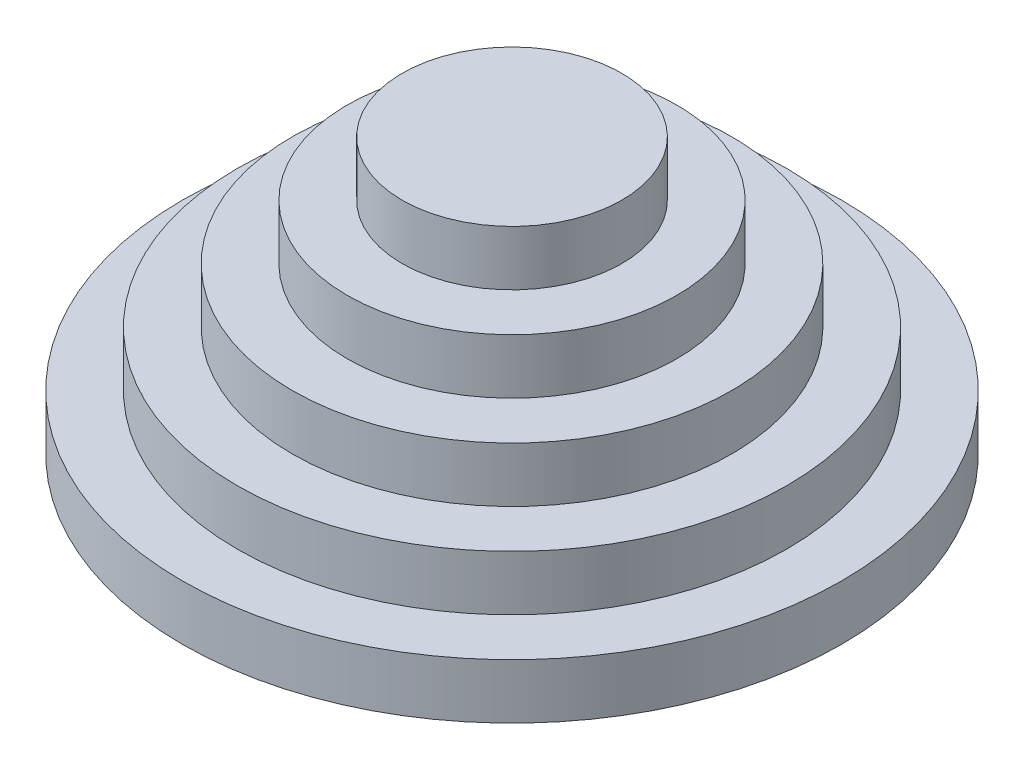
ISO-10303-21;
HEADER;
FILE_DESCRIPTION(('STEP AP214'),'2;1');
FILE_NAME('part.step','',(''),(''),'','','');
FILE_SCHEMA(('AUTOMOTIVE_DESIGN { 1 0 10303 214 1 1 1 1 }'));
ENDSEC;
DATA;
#1=APPLICATION_CONTEXT('core data for automotive mechanical design processes');
#2=APPLICATION_PROTOCOL_DEFINITION('international standard','automotive_design',2000,#1);
#3=PRODUCT_CONTEXT('',#1,'mechanical');
#4=PRODUCT('Part','Part','',(#3));
#5=PRODUCT_RELATED_PRODUCT_CATEGORY('part','',(#4));
#6=PRODUCT_DEFINITION_FORMATION('','',#4);
#7=PRODUCT_DEFINITION_CONTEXT('part definition',#1,'design');
#8=PRODUCT_DEFINITION('design','',#6,#7);
#9=PRODUCT_DEFINITION_SHAPE('','',#8);
#10=(LENGTH_UNIT() NAMED_UNIT(*) SI_UNIT(.MILLI.,.METRE.));
#11=(NAMED_UNIT(*) PLANE_ANGLE_UNIT() SI_UNIT($,.RADIAN.));
#12=(NAMED_UNIT(*) SI_UNIT($,.STERADIAN.) SOLID_ANGLE_UNIT());
#13=UNCERTAINTY_MEASURE_WITH_UNIT(LENGTH_MEASURE(1.E-05),#10,'distance_accuracy_value','');
#14=(GEOMETRIC_REPRESENTATION_CONTEXT(3) GLOBAL_UNCERTAINTY_ASSIGNED_CONTEXT((#13)) GLOBAL_UNIT_ASSIGNED_CONTEXT((#10,
#11,#12)) REPRESENTATION_CONTEXT('',''));
#15=CARTESIAN_POINT('',(0.,0.,0.));
#16=DIRECTION('',(0.,0.,1.));
#17=DIRECTION('',(1.,0.,0.));
#18=AXIS2_PLACEMENT_3D('',#15,#16,#17);
#19=CARTESIAN_POINT('',(0.,5.,0.));
#20=DIRECTION('',(0.,-1.,0.));
#21=DIRECTION('',(0.,0.,-1.));
#22=AXIS2_PLACEMENT_3D('',#19,#20,#21);
#23=CYLINDRICAL_SURFACE('',#22,25.);
#24=CARTESIAN_POINT('',(0.,5.,0.));
#25=DIRECTION('',(0.,1.,0.));
#26=DIRECTION('',(0.,0.,1.));
#27=AXIS2_PLACEMENT_3D('',#24,#25,#26);
#28=CIRCLE('',#27,25.);
#29=CARTESIAN_POINT('',(0.,5.,25.));
#30=VERTEX_POINT('',#29);
#31=EDGE_CURVE('E10',#30,#30,#28,.T.);
#32=ORIENTED_EDGE('',*,*,#31,.F.);
#33=EDGE_LOOP('',(#32));
#34=FACE_BOUND('',#33,.T.);
#35=CARTESIAN_POINT('',(0.,0.,0.));
#36=DIRECTION('',(0.,-1.,0.));
#37=DIRECTION('',(0.,0.,-1.));
#38=AXIS2_PLACEMENT_3D('',#35,#36,#37);
#39=CIRCLE('',#38,25.);
#40=CARTESIAN_POINT('',(0.,0.,-25.));
#41=VERTEX_POINT('',#40);
#42=EDGE_CURVE('E57',#41,#41,#39,.T.);
#43=ORIENTED_EDGE('',*,*,#42,.F.);
#44=EDGE_LOOP('',(#43));
#45=FACE_BOUND('',#44,.T.);
#46=ADVANCED_FACE('F31',(#34,#45),#23,.T.);
#47=CARTESIAN_POINT('',(0.,5.,0.));
#48=DIRECTION('',(0.,1.,0.));
#49=DIRECTION('',(0.,0.,1.));
#50=AXIS2_PLACEMENT_3D('',#47,#48,#49);
#51=PLANE('',#50);
#52=CARTESIAN_POINT('',(0.,5.,0.));
#53=DIRECTION('',(0.,1.,0.));
#54=DIRECTION('',(0.,0.,1.));
#55=AXIS2_PLACEMENT_3D('',#52,#53,#54);
#56=CIRCLE('',#55,20.);
#57=CARTESIAN_POINT('',(0.,5.,20.));
#58=VERTEX_POINT('',#57);
#59=EDGE_CURVE('E41',#58,#58,#56,.T.);
#60=ORIENTED_EDGE('',*,*,#59,.F.);
#61=EDGE_LOOP('',(#60));
#62=FACE_BOUND('',#61,.T.);
#63=ORIENTED_EDGE('',*,*,#31,.T.);
#64=EDGE_LOOP('',(#63));
#65=FACE_BOUND('',#64,.T.);
#66=ADVANCED_FACE('F87',(#62,#65),#51,.T.);
#67=CARTESIAN_POINT('',(0.,10.,0.));
#68=DIRECTION('',(0.,-1.,0.));
#69=DIRECTION('',(0.,0.,-1.));
#70=AXIS2_PLACEMENT_3D('',#67,#68,#69);
#71=CYLINDRICAL_SURFACE('',#70,20.);
#72=CARTESIAN_POINT('',(0.,10.,0.));
#73=DIRECTION('',(0.,1.,0.));
#74=DIRECTION('',(0.,0.,1.));
#75=AXIS2_PLACEMENT_3D('',#72,#73,#74);
#76=CIRCLE('',#75,20.);
#77=CARTESIAN_POINT('',(0.,10.,20.));
#78=VERTEX_POINT('',#77);
#79=EDGE_CURVE('E37',#78,#78,#76,.T.);
#80=ORIENTED_EDGE('',*,*,#79,.F.);
#81=EDGE_LOOP('',(#80));
#82=FACE_BOUND('',#81,.T.);
#83=ORIENTED_EDGE('',*,*,#59,.T.);
#84=EDGE_LOOP('',(#83));
#85=FACE_BOUND('',#84,.T.);
#86=ADVANCED_FACE('F92',(#82,#85),#71,.T.);
#87=CARTESIAN_POINT('',(0.,10.,0.));
#88=DIRECTION('',(0.,1.,0.));
#89=DIRECTION('',(0.,0.,1.));
#90=AXIS2_PLACEMENT_3D('',#87,#88,#89);
#91=PLANE('',#90);
#92=CARTESIAN_POINT('',(0.,10.,0.));
#93=DIRECTION('',(0.,1.,0.));
#94=DIRECTION('',(0.,0.,1.));
#95=AXIS2_PLACEMENT_3D('',#92,#93,#94);
#96=CIRCLE('',#95,15.);
#97=CARTESIAN_POINT('',(0.,10.,15.));
#98=VERTEX_POINT('',#97);
#99=EDGE_CURVE('E48',#98,#98,#96,.T.);
#100=ORIENTED_EDGE('',*,*,#99,.F.);
#101=EDGE_LOOP('',(#100));
#102=FACE_BOUND('',#101,.T.);
#103=ORIENTED_EDGE('',*,*,#79,.T.);
#104=EDGE_LOOP('',(#103));
#105=FACE_BOUND('',#104,.T.);
#106=ADVANCED_FACE('F99',(#102,#105),#91,.T.);
#107=CARTESIAN_POINT('',(0.,15.,0.));
#108=DIRECTION('',(0.,-1.,0.));
#109=DIRECTION('',(0.,0.,-1.));
#110=AXIS2_PLACEMENT_3D('',#107,#108,#109);
#111=CYLINDRICAL_SURFACE('',#110,15.);
#112=CARTESIAN_POINT('',(0.,15.,0.));
#113=DIRECTION('',(0.,1.,0.));
#114=DIRECTION('',(0.,0.,1.));
#115=AXIS2_PLACEMENT_3D('',#112,#113,#114);
#116=CIRCLE('',#115,15.);
#117=CARTESIAN_POINT('',(0.,15.,15.));
#118=VERTEX_POINT('',#117);
#119=EDGE_CURVE('E46',#118,#118,#116,.T.);
#120=ORIENTED_EDGE('',*,*,#119,.F.);
#121=EDGE_LOOP('',(#120));
#122=FACE_BOUND('',#121,.T.);
#123=ORIENTED_EDGE('',*,*,#99,.T.);
#124=EDGE_LOOP('',(#123));
#125=FACE_BOUND('',#124,.T.);
#126=ADVANCED_FACE('F106',(#122,#125),#111,.T.);
#127=CARTESIAN_POINT('',(0.,15.,0.));
#128=DIRECTION('',(0.,1.,0.));
#129=DIRECTION('',(0.,0.,1.));
#130=AXIS2_PLACEMENT_3D('',#127,#128,#129);
#131=PLANE('',#130);
#132=CARTESIAN_POINT('',(0.,15.,0.));
#133=DIRECTION('',(0.,1.,0.));
#134=DIRECTION('',(0.,0.,1.));
#135=AXIS2_PLACEMENT_3D('',#132,#133,#134);
#136=CIRCLE('',#135,10.);
#137=CARTESIAN_POINT('',(0.,15.,10.));
#138=VERTEX_POINT('',#137);
#139=EDGE_CURVE('E54',#138,#138,#136,.T.);
#140=ORIENTED_EDGE('',*,*,#139,.F.);
#141=EDGE_LOOP('',(#140));
#142=FACE_BOUND('',#141,.T.);
#143=ORIENTED_EDGE('',*,*,#119,.T.);
#144=EDGE_LOOP('',(#143));
#145=FACE_BOUND('',#144,.T.);
#146=ADVANCED_FACE('F110',(#142,#145),#131,.T.);
#147=CARTESIAN_POINT('',(0.,20.,0.));
#148=DIRECTION('',(0.,-1.,0.));
#149=DIRECTION('',(0.,0.,-1.));
#150=AXIS2_PLACEMENT_3D('',#147,#148,#149);
#151=CYLINDRICAL_SURFACE('',#150,10.);
#152=CARTESIAN_POINT('',(0.,20.,0.));
#153=DIRECTION('',(0.,1.,0.));
#154=DIRECTION('',(0.,0.,1.));
#155=AXIS2_PLACEMENT_3D('',#152,#153,#154);
#156=CIRCLE('',#155,10.);
#157=CARTESIAN_POINT('',(0.,20.,10.));
#158=VERTEX_POINT('',#157);
#159=EDGE_CURVE('E51',#158,#158,#156,.T.);
#160=ORIENTED_EDGE('',*,*,#159,.F.);
#161=EDGE_LOOP('',(#160));
#162=FACE_BOUND('',#161,.T.);
#163=ORIENTED_EDGE('',*,*,#139,.T.);
#164=EDGE_LOOP('',(#163));
#165=FACE_BOUND('',#164,.T.);
#166=ADVANCED_FACE('F114',(#162,#165),#151,.T.);
#167=CARTESIAN_POINT('',(0.,20.,0.));
#168=DIRECTION('',(0.,1.,0.));
#169=DIRECTION('',(0.,0.,1.));
#170=AXIS2_PLACEMENT_3D('',#167,#168,#169);
#171=PLANE('',#170);
#172=ORIENTED_EDGE('',*,*,#159,.T.);
#173=EDGE_LOOP('',(#172));
#174=FACE_BOUND('',#173,.T.);
#175=ADVANCED_FACE('F74',(#174),#171,.T.);
#176=CARTESIAN_POINT('',(0.,-5.,0.));
#177=DIRECTION('',(0.,1.,0.));
#178=DIRECTION('',(0.,0.,1.));
#179=AXIS2_PLACEMENT_3D('',#176,#177,#178);
#180=CYLINDRICAL_SURFACE('',#179,30.);
#181=CARTESIAN_POINT('',(0.,-5.,0.));
#182=DIRECTION('',(0.,-1.,0.));
#183=DIRECTION('',(0.,0.,-1.));
#184=AXIS2_PLACEMENT_3D('',#181,#182,#183);
#185=CIRCLE('',#184,30.);
#186=CARTESIAN_POINT('',(0.,-5.,-30.));
#187=VERTEX_POINT('',#186);
#188=EDGE_CURVE('E62',#187,#187,#185,.T.);
#189=ORIENTED_EDGE('',*,*,#188,.F.);
#190=EDGE_LOOP('',(#189));
#191=FACE_BOUND('',#190,.T.);
#192=CARTESIAN_POINT('',(0.,0.,0.));
#193=DIRECTION('',(0.,-1.,0.));
#194=DIRECTION('',(0.,0.,-1.));
#195=AXIS2_PLACEMENT_3D('',#192,#193,#194);
#196=CIRCLE('',#195,30.);
#197=CARTESIAN_POINT('',(0.,0.,-30.));
#198=VERTEX_POINT('',#197);
#199=EDGE_CURVE('E63',#198,#198,#196,.T.);
#200=ORIENTED_EDGE('',*,*,#199,.T.);
#201=EDGE_LOOP('',(#200));
#202=FACE_BOUND('',#201,.T.);
#203=ADVANCED_FACE('F71',(#191,#202),#180,.T.);
#204=CARTESIAN_POINT('',(0.,-5.,0.));
#205=DIRECTION('',(0.,-1.,0.));
#206=DIRECTION('',(0.,0.,-1.));
#207=AXIS2_PLACEMENT_3D('',#204,#205,#206);
#208=PLANE('',#207);
#209=ORIENTED_EDGE('',*,*,#188,.T.);
#210=EDGE_LOOP('',(#209));
#211=FACE_BOUND('',#210,.T.);
#212=ADVANCED_FACE('F69',(#211),#208,.T.);
#213=CARTESIAN_POINT('',(0.,0.,0.));
#214=DIRECTION('',(0.,-1.,0.));
#215=DIRECTION('',(0.,0.,-1.));
#216=AXIS2_PLACEMENT_3D('',#213,#214,#215);
#217=PLANE('',#216);
#218=ORIENTED_EDGE('',*,*,#42,.T.);
#219=EDGE_LOOP('',(#218));
#220=FACE_BOUND('',#219,.T.);
#221=ORIENTED_EDGE('',*,*,#199,.F.);
#222=EDGE_LOOP('',(#221));
#223=FACE_BOUND('',#222,.T.);
#224=ADVANCED_FACE('F78',(#220,#223),#217,.F.);
#225=CLOSED_SHELL('',(#46,#66,#86,#106,#126,#146,#166,#175,#203,#212,#224));
#226=MANIFOLD_SOLID_BREP('B2',#225);
#227=ADVANCED_BREP_SHAPE_REPRESENTATION('',(#18,#226),#14);
#228=SHAPE_DEFINITION_REPRESENTATION(#9,#227);
ENDSEC;
END-ISO-10303-21;
